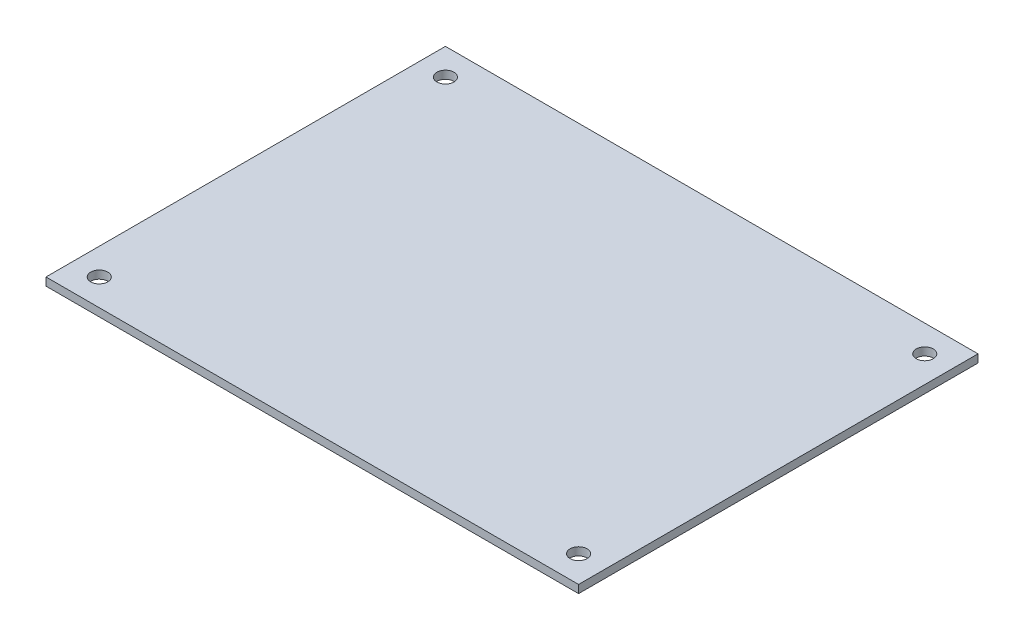
ISO-10303-21;
HEADER;
FILE_DESCRIPTION(('STEP AP214'),'2;1');
FILE_NAME('part.step','',(''),(''),'','','');
FILE_SCHEMA(('AUTOMOTIVE_DESIGN { 1 0 10303 214 1 1 1 1 }'));
ENDSEC;
DATA;
#1=APPLICATION_CONTEXT('core data for automotive mechanical design processes');
#2=APPLICATION_PROTOCOL_DEFINITION('international standard','automotive_design',2000,#1);
#3=PRODUCT_CONTEXT('',#1,'mechanical');
#4=PRODUCT('Part','Part','',(#3));
#5=PRODUCT_RELATED_PRODUCT_CATEGORY('part','',(#4));
#6=PRODUCT_DEFINITION_FORMATION('','',#4);
#7=PRODUCT_DEFINITION_CONTEXT('part definition',#1,'design');
#8=PRODUCT_DEFINITION('design','',#6,#7);
#9=PRODUCT_DEFINITION_SHAPE('','',#8);
#10=(LENGTH_UNIT() NAMED_UNIT(*) SI_UNIT(.MILLI.,.METRE.));
#11=(NAMED_UNIT(*) PLANE_ANGLE_UNIT() SI_UNIT($,.RADIAN.));
#12=(NAMED_UNIT(*) SI_UNIT($,.STERADIAN.) SOLID_ANGLE_UNIT());
#13=UNCERTAINTY_MEASURE_WITH_UNIT(LENGTH_MEASURE(1.E-05),#10,'distance_accuracy_value','');
#14=(GEOMETRIC_REPRESENTATION_CONTEXT(3) GLOBAL_UNCERTAINTY_ASSIGNED_CONTEXT((#13)) GLOBAL_UNIT_ASSIGNED_CONTEXT((#10,
#11,#12)) REPRESENTATION_CONTEXT('',''));
#15=CARTESIAN_POINT('',(0.,0.,0.));
#16=DIRECTION('',(0.,0.,1.));
#17=DIRECTION('',(1.,0.,0.));
#18=AXIS2_PLACEMENT_3D('',#15,#16,#17);
#19=CARTESIAN_POINT('',(0.,1.5,0.));
#20=DIRECTION('',(0.,-1.,0.));
#21=DIRECTION('',(0.,0.,-1.));
#22=AXIS2_PLACEMENT_3D('',#19,#20,#21);
#23=PLANE('',#22);
#24=DIRECTION('',(0.,0.,-1.));
#25=VECTOR('',#24,1.);
#26=CARTESIAN_POINT('',(50.,1.5,37.5));
#27=LINE('',#26,#25);
#28=CARTESIAN_POINT('',(50.,1.5,37.5));
#29=VERTEX_POINT('',#28);
#30=CARTESIAN_POINT('',(50.,1.5,-37.5));
#31=VERTEX_POINT('',#30);
#32=EDGE_CURVE('E92',#29,#31,#27,.T.);
#33=ORIENTED_EDGE('',*,*,#32,.T.);
#34=DIRECTION('',(-1.,0.,0.));
#35=VECTOR('',#34,1.);
#36=CARTESIAN_POINT('',(-50.,1.5,-37.5));
#37=LINE('',#36,#35);
#38=CARTESIAN_POINT('',(-50.,1.5,-37.5));
#39=VERTEX_POINT('',#38);
#40=EDGE_CURVE('E87',#31,#39,#37,.T.);
#41=ORIENTED_EDGE('',*,*,#40,.T.);
#42=DIRECTION('',(0.,0.,1.));
#43=VECTOR('',#42,1.);
#44=CARTESIAN_POINT('',(-50.,1.5,37.5));
#45=LINE('',#44,#43);
#46=CARTESIAN_POINT('',(-50.,1.5,37.5));
#47=VERTEX_POINT('',#46);
#48=EDGE_CURVE('E90',#39,#47,#45,.T.);
#49=ORIENTED_EDGE('',*,*,#48,.T.);
#50=DIRECTION('',(1.,0.,0.));
#51=VECTOR('',#50,1.);
#52=CARTESIAN_POINT('',(-50.,1.5,37.5));
#53=LINE('',#52,#51);
#54=EDGE_CURVE('E57',#47,#29,#53,.T.);
#55=ORIENTED_EDGE('',*,*,#54,.T.);
#56=EDGE_LOOP('',(#33,#41,#49,#55));
#57=FACE_BOUND('',#56,.T.);
#58=CARTESIAN_POINT('',(-45.,1.5,-32.5));
#59=DIRECTION('',(0.,1.,0.));
#60=DIRECTION('',(0.,0.,1.));
#61=AXIS2_PLACEMENT_3D('',#58,#59,#60);
#62=CIRCLE('',#61,1.6);
#63=CARTESIAN_POINT('',(-45.,1.5,-30.9));
#64=VERTEX_POINT('',#63);
#65=EDGE_CURVE('E112',#64,#64,#62,.T.);
#66=ORIENTED_EDGE('',*,*,#65,.F.);
#67=EDGE_LOOP('',(#66));
#68=FACE_BOUND('',#67,.T.);
#69=CARTESIAN_POINT('',(45.,1.5,-32.5));
#70=DIRECTION('',(0.,1.,0.));
#71=DIRECTION('',(0.,0.,-1.));
#72=AXIS2_PLACEMENT_3D('',#69,#70,#71);
#73=CIRCLE('',#72,1.6);
#74=CARTESIAN_POINT('',(45.,1.5,-34.1));
#75=VERTEX_POINT('',#74);
#76=EDGE_CURVE('E134',#75,#75,#73,.T.);
#77=ORIENTED_EDGE('',*,*,#76,.F.);
#78=EDGE_LOOP('',(#77));
#79=FACE_BOUND('',#78,.T.);
#80=CARTESIAN_POINT('',(45.,1.5,32.5));
#81=DIRECTION('',(0.,1.,0.));
#82=DIRECTION('',(0.,0.,1.));
#83=AXIS2_PLACEMENT_3D('',#80,#81,#82);
#84=CIRCLE('',#83,1.6);
#85=CARTESIAN_POINT('',(45.,1.5,34.1));
#86=VERTEX_POINT('',#85);
#87=EDGE_CURVE('E142',#86,#86,#84,.T.);
#88=ORIENTED_EDGE('',*,*,#87,.F.);
#89=EDGE_LOOP('',(#88));
#90=FACE_BOUND('',#89,.T.);
#91=CARTESIAN_POINT('',(-45.,1.5,32.5));
#92=DIRECTION('',(0.,1.,0.));
#93=DIRECTION('',(0.,0.,-1.));
#94=AXIS2_PLACEMENT_3D('',#91,#92,#93);
#95=CIRCLE('',#94,1.6);
#96=CARTESIAN_POINT('',(-45.,1.5,30.9));
#97=VERTEX_POINT('',#96);
#98=EDGE_CURVE('E150',#97,#97,#95,.T.);
#99=ORIENTED_EDGE('',*,*,#98,.F.);
#100=EDGE_LOOP('',(#99));
#101=FACE_BOUND('',#100,.T.);
#102=ADVANCED_FACE('F39',(#57,#68,#79,#90,#101),#23,.F.);
#103=CARTESIAN_POINT('',(0.,0.,0.));
#104=DIRECTION('',(0.,-1.,0.));
#105=DIRECTION('',(0.,0.,-1.));
#106=AXIS2_PLACEMENT_3D('',#103,#104,#105);
#107=PLANE('',#106);
#108=CARTESIAN_POINT('',(45.,0.,32.5));
#109=DIRECTION('',(0.,1.,0.));
#110=DIRECTION('',(0.,0.,1.));
#111=AXIS2_PLACEMENT_3D('',#108,#109,#110);
#112=CIRCLE('',#111,1.6);
#113=CARTESIAN_POINT('',(45.,0.,34.1));
#114=VERTEX_POINT('',#113);
#115=EDGE_CURVE('E146',#114,#114,#112,.T.);
#116=ORIENTED_EDGE('',*,*,#115,.T.);
#117=EDGE_LOOP('',(#116));
#118=FACE_BOUND('',#117,.T.);
#119=CARTESIAN_POINT('',(-45.,0.,-32.5));
#120=DIRECTION('',(0.,1.,0.));
#121=DIRECTION('',(0.,0.,1.));
#122=AXIS2_PLACEMENT_3D('',#119,#120,#121);
#123=CIRCLE('',#122,1.6);
#124=CARTESIAN_POINT('',(-45.,0.,-30.9));
#125=VERTEX_POINT('',#124);
#126=EDGE_CURVE('E130',#125,#125,#123,.T.);
#127=ORIENTED_EDGE('',*,*,#126,.T.);
#128=EDGE_LOOP('',(#127));
#129=FACE_BOUND('',#128,.T.);
#130=DIRECTION('',(0.,0.,-1.));
#131=VECTOR('',#130,1.);
#132=CARTESIAN_POINT('',(50.,0.,37.5));
#133=LINE('',#132,#131);
#134=CARTESIAN_POINT('',(50.,0.,37.5));
#135=VERTEX_POINT('',#134);
#136=CARTESIAN_POINT('',(50.,0.,-37.5));
#137=VERTEX_POINT('',#136);
#138=EDGE_CURVE('E108',#135,#137,#133,.T.);
#139=ORIENTED_EDGE('',*,*,#138,.F.);
#140=DIRECTION('',(1.,0.,0.));
#141=VECTOR('',#140,1.);
#142=CARTESIAN_POINT('',(-50.,0.,37.5));
#143=LINE('',#142,#141);
#144=CARTESIAN_POINT('',(-50.,0.,37.5));
#145=VERTEX_POINT('',#144);
#146=EDGE_CURVE('E80',#145,#135,#143,.T.);
#147=ORIENTED_EDGE('',*,*,#146,.F.);
#148=DIRECTION('',(0.,0.,1.));
#149=VECTOR('',#148,1.);
#150=CARTESIAN_POINT('',(-50.,0.,37.5));
#151=LINE('',#150,#149);
#152=CARTESIAN_POINT('',(-50.,0.,-37.5));
#153=VERTEX_POINT('',#152);
#154=EDGE_CURVE('E74',#153,#145,#151,.T.);
#155=ORIENTED_EDGE('',*,*,#154,.F.);
#156=DIRECTION('',(-1.,0.,0.));
#157=VECTOR('',#156,1.);
#158=CARTESIAN_POINT('',(-50.,0.,-37.5));
#159=LINE('',#158,#157);
#160=EDGE_CURVE('E97',#137,#153,#159,.T.);
#161=ORIENTED_EDGE('',*,*,#160,.F.);
#162=EDGE_LOOP('',(#139,#147,#155,#161));
#163=FACE_BOUND('',#162,.T.);
#164=CARTESIAN_POINT('',(45.,0.,-32.5));
#165=DIRECTION('',(0.,1.,0.));
#166=DIRECTION('',(0.,0.,-1.));
#167=AXIS2_PLACEMENT_3D('',#164,#165,#166);
#168=CIRCLE('',#167,1.6);
#169=CARTESIAN_POINT('',(45.,0.,-34.1));
#170=VERTEX_POINT('',#169);
#171=EDGE_CURVE('E138',#170,#170,#168,.T.);
#172=ORIENTED_EDGE('',*,*,#171,.T.);
#173=EDGE_LOOP('',(#172));
#174=FACE_BOUND('',#173,.T.);
#175=CARTESIAN_POINT('',(-45.,0.,32.5));
#176=DIRECTION('',(0.,1.,0.));
#177=DIRECTION('',(0.,0.,-1.));
#178=AXIS2_PLACEMENT_3D('',#175,#176,#177);
#179=CIRCLE('',#178,1.6);
#180=CARTESIAN_POINT('',(-45.,0.,30.9));
#181=VERTEX_POINT('',#180);
#182=EDGE_CURVE('E154',#181,#181,#179,.T.);
#183=ORIENTED_EDGE('',*,*,#182,.T.);
#184=EDGE_LOOP('',(#183));
#185=FACE_BOUND('',#184,.T.);
#186=ADVANCED_FACE('F125',(#118,#129,#163,#174,#185),#107,.T.);
#187=CARTESIAN_POINT('',(50.,1.5,37.5));
#188=DIRECTION('',(-1.,0.,0.));
#189=DIRECTION('',(0.,0.,1.));
#190=AXIS2_PLACEMENT_3D('',#187,#188,#189);
#191=PLANE('',#190);
#192=ORIENTED_EDGE('',*,*,#138,.T.);
#193=DIRECTION('',(0.,-1.,0.));
#194=VECTOR('',#193,1.);
#195=CARTESIAN_POINT('',(50.,1.5,-37.5));
#196=LINE('',#195,#194);
#197=EDGE_CURVE('E11',#31,#137,#196,.T.);
#198=ORIENTED_EDGE('',*,*,#197,.F.);
#199=ORIENTED_EDGE('',*,*,#32,.F.);
#200=DIRECTION('',(0.,-1.,0.));
#201=VECTOR('',#200,1.);
#202=CARTESIAN_POINT('',(50.,1.5,37.5));
#203=LINE('',#202,#201);
#204=EDGE_CURVE('E104',#29,#135,#203,.T.);
#205=ORIENTED_EDGE('',*,*,#204,.T.);
#206=EDGE_LOOP('',(#192,#198,#199,#205));
#207=FACE_BOUND('',#206,.T.);
#208=ADVANCED_FACE('F41',(#207),#191,.F.);
#209=CARTESIAN_POINT('',(-50.,1.5,-37.5));
#210=DIRECTION('',(0.,0.,1.));
#211=DIRECTION('',(1.,0.,0.));
#212=AXIS2_PLACEMENT_3D('',#209,#210,#211);
#213=PLANE('',#212);
#214=ORIENTED_EDGE('',*,*,#160,.T.);
#215=DIRECTION('',(0.,-1.,0.));
#216=VECTOR('',#215,1.);
#217=CARTESIAN_POINT('',(-50.,1.5,-37.5));
#218=LINE('',#217,#216);
#219=EDGE_CURVE('E49',#39,#153,#218,.T.);
#220=ORIENTED_EDGE('',*,*,#219,.F.);
#221=ORIENTED_EDGE('',*,*,#40,.F.);
#222=ORIENTED_EDGE('',*,*,#197,.T.);
#223=EDGE_LOOP('',(#214,#220,#221,#222));
#224=FACE_BOUND('',#223,.T.);
#225=ADVANCED_FACE('F96',(#224),#213,.F.);
#226=CARTESIAN_POINT('',(-50.,1.5,37.5));
#227=DIRECTION('',(1.,0.,0.));
#228=DIRECTION('',(0.,0.,-1.));
#229=AXIS2_PLACEMENT_3D('',#226,#227,#228);
#230=PLANE('',#229);
#231=ORIENTED_EDGE('',*,*,#154,.T.);
#232=DIRECTION('',(0.,-1.,0.));
#233=VECTOR('',#232,1.);
#234=CARTESIAN_POINT('',(-50.,1.5,37.5));
#235=LINE('',#234,#233);
#236=EDGE_CURVE('E99',#47,#145,#235,.T.);
#237=ORIENTED_EDGE('',*,*,#236,.F.);
#238=ORIENTED_EDGE('',*,*,#48,.F.);
#239=ORIENTED_EDGE('',*,*,#219,.T.);
#240=EDGE_LOOP('',(#231,#237,#238,#239));
#241=FACE_BOUND('',#240,.T.);
#242=ADVANCED_FACE('F100',(#241),#230,.F.);
#243=CARTESIAN_POINT('',(-50.,1.5,37.5));
#244=DIRECTION('',(0.,0.,-1.));
#245=DIRECTION('',(-1.,0.,0.));
#246=AXIS2_PLACEMENT_3D('',#243,#244,#245);
#247=PLANE('',#246);
#248=ORIENTED_EDGE('',*,*,#146,.T.);
#249=ORIENTED_EDGE('',*,*,#204,.F.);
#250=ORIENTED_EDGE('',*,*,#54,.F.);
#251=ORIENTED_EDGE('',*,*,#236,.T.);
#252=EDGE_LOOP('',(#248,#249,#250,#251));
#253=FACE_BOUND('',#252,.T.);
#254=ADVANCED_FACE('F122',(#253),#247,.F.);
#255=CARTESIAN_POINT('',(-45.,1.5,-32.5));
#256=DIRECTION('',(0.,-1.,0.));
#257=DIRECTION('',(0.,0.,-1.));
#258=AXIS2_PLACEMENT_3D('',#255,#256,#257);
#259=CYLINDRICAL_SURFACE('',#258,1.6);
#260=ORIENTED_EDGE('',*,*,#65,.T.);
#261=EDGE_LOOP('',(#260));
#262=FACE_BOUND('',#261,.T.);
#263=ORIENTED_EDGE('',*,*,#126,.F.);
#264=EDGE_LOOP('',(#263));
#265=FACE_BOUND('',#264,.T.);
#266=ADVANCED_FACE('F173',(#262,#265),#259,.F.);
#267=CARTESIAN_POINT('',(45.,1.5,-32.5));
#268=DIRECTION('',(0.,-1.,0.));
#269=DIRECTION('',(0.,0.,-1.));
#270=AXIS2_PLACEMENT_3D('',#267,#268,#269);
#271=CYLINDRICAL_SURFACE('',#270,1.6);
#272=ORIENTED_EDGE('',*,*,#76,.T.);
#273=EDGE_LOOP('',(#272));
#274=FACE_BOUND('',#273,.T.);
#275=ORIENTED_EDGE('',*,*,#171,.F.);
#276=EDGE_LOOP('',(#275));
#277=FACE_BOUND('',#276,.T.);
#278=ADVANCED_FACE('F219',(#274,#277),#271,.F.);
#279=CARTESIAN_POINT('',(45.,1.5,32.5));
#280=DIRECTION('',(0.,-1.,0.));
#281=DIRECTION('',(0.,0.,-1.));
#282=AXIS2_PLACEMENT_3D('',#279,#280,#281);
#283=CYLINDRICAL_SURFACE('',#282,1.6);
#284=ORIENTED_EDGE('',*,*,#87,.T.);
#285=EDGE_LOOP('',(#284));
#286=FACE_BOUND('',#285,.T.);
#287=ORIENTED_EDGE('',*,*,#115,.F.);
#288=EDGE_LOOP('',(#287));
#289=FACE_BOUND('',#288,.T.);
#290=ADVANCED_FACE('F227',(#286,#289),#283,.F.);
#291=CARTESIAN_POINT('',(-45.,1.5,32.5));
#292=DIRECTION('',(0.,-1.,0.));
#293=DIRECTION('',(0.,0.,-1.));
#294=AXIS2_PLACEMENT_3D('',#291,#292,#293);
#295=CYLINDRICAL_SURFACE('',#294,1.6);
#296=ORIENTED_EDGE('',*,*,#98,.T.);
#297=EDGE_LOOP('',(#296));
#298=FACE_BOUND('',#297,.T.);
#299=ORIENTED_EDGE('',*,*,#182,.F.);
#300=EDGE_LOOP('',(#299));
#301=FACE_BOUND('',#300,.T.);
#302=ADVANCED_FACE('F162',(#298,#301),#295,.F.);
#303=CLOSED_SHELL('',(#102,#186,#208,#225,#242,#254,#266,#278,#290,#302));
#304=MANIFOLD_SOLID_BREP('B2',#303);
#305=ADVANCED_BREP_SHAPE_REPRESENTATION('',(#18,#304),#14);
#306=SHAPE_DEFINITION_REPRESENTATION(#9,#305);
ENDSEC;
END-ISO-10303-21;
